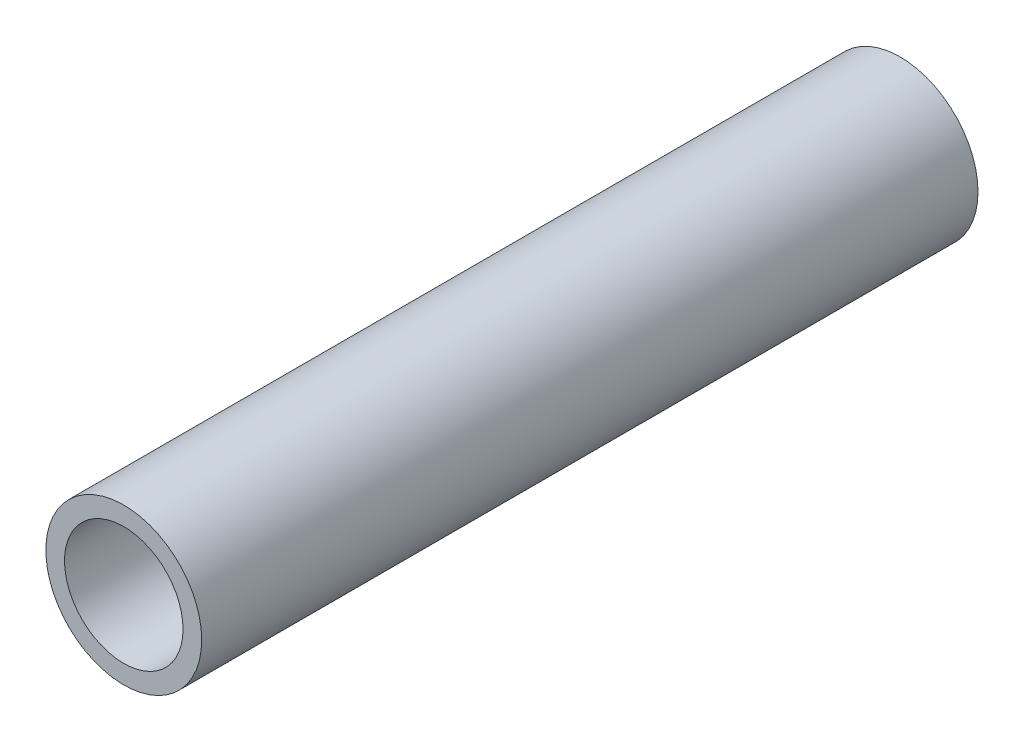
ISO-10303-21;
HEADER;
FILE_DESCRIPTION(('STEP AP214'),'2;1');
FILE_NAME('part.step','',(''),(''),'','','');
FILE_SCHEMA(('AUTOMOTIVE_DESIGN { 1 0 10303 214 1 1 1 1 }'));
ENDSEC;
DATA;
#1=APPLICATION_CONTEXT('core data for automotive mechanical design processes');
#2=APPLICATION_PROTOCOL_DEFINITION('international standard','automotive_design',2000,#1);
#3=PRODUCT_CONTEXT('',#1,'mechanical');
#4=PRODUCT('Part','Part','',(#3));
#5=PRODUCT_RELATED_PRODUCT_CATEGORY('part','',(#4));
#6=PRODUCT_DEFINITION_FORMATION('','',#4);
#7=PRODUCT_DEFINITION_CONTEXT('part definition',#1,'design');
#8=PRODUCT_DEFINITION('design','',#6,#7);
#9=PRODUCT_DEFINITION_SHAPE('','',#8);
#10=(LENGTH_UNIT() NAMED_UNIT(*) SI_UNIT(.MILLI.,.METRE.));
#11=(NAMED_UNIT(*) PLANE_ANGLE_UNIT() SI_UNIT($,.RADIAN.));
#12=(NAMED_UNIT(*) SI_UNIT($,.STERADIAN.) SOLID_ANGLE_UNIT());
#13=UNCERTAINTY_MEASURE_WITH_UNIT(LENGTH_MEASURE(1.E-05),#10,'distance_accuracy_value','');
#14=(GEOMETRIC_REPRESENTATION_CONTEXT(3) GLOBAL_UNCERTAINTY_ASSIGNED_CONTEXT((#13)) GLOBAL_UNIT_ASSIGNED_CONTEXT((#10,
#11,#12)) REPRESENTATION_CONTEXT('',''));
#15=CARTESIAN_POINT('',(0.,0.,0.));
#16=DIRECTION('',(0.,0.,1.));
#17=DIRECTION('',(1.,0.,0.));
#18=AXIS2_PLACEMENT_3D('',#15,#16,#17);
#19=CARTESIAN_POINT('',(0.,0.,166.37));
#20=DIRECTION('',(0.,0.,1.));
#21=DIRECTION('',(1.,0.,0.));
#22=AXIS2_PLACEMENT_3D('',#19,#20,#21);
#23=PLANE('',#22);
#24=CARTESIAN_POINT('',(0.,0.,166.37));
#25=DIRECTION('',(0.,0.,1.));
#26=DIRECTION('',(1.,0.,0.));
#27=AXIS2_PLACEMENT_3D('',#24,#25,#26);
#28=CIRCLE('',#27,16.7005);
#29=CARTESIAN_POINT('',(16.7005,0.,166.37));
#30=VERTEX_POINT('',#29);
#31=EDGE_CURVE('E10',#30,#30,#28,.T.);
#32=ORIENTED_EDGE('',*,*,#31,.T.);
#33=EDGE_LOOP('',(#32));
#34=FACE_BOUND('',#33,.T.);
#35=CARTESIAN_POINT('',(0.,0.,166.37));
#36=DIRECTION('',(0.,0.,1.));
#37=DIRECTION('',(1.,0.,0.));
#38=AXIS2_PLACEMENT_3D('',#35,#36,#37);
#39=CIRCLE('',#38,12.7);
#40=CARTESIAN_POINT('',(12.7,0.,166.37));
#41=VERTEX_POINT('',#40);
#42=EDGE_CURVE('E44',#41,#41,#39,.T.);
#43=ORIENTED_EDGE('',*,*,#42,.F.);
#44=EDGE_LOOP('',(#43));
#45=FACE_BOUND('',#44,.T.);
#46=ADVANCED_FACE('F33',(#34,#45),#23,.T.);
#47=CARTESIAN_POINT('',(0.,0.,0.));
#48=DIRECTION('',(0.,0.,1.));
#49=DIRECTION('',(1.,0.,0.));
#50=AXIS2_PLACEMENT_3D('',#47,#48,#49);
#51=PLANE('',#50);
#52=CARTESIAN_POINT('',(0.,0.,0.));
#53=DIRECTION('',(0.,0.,1.));
#54=DIRECTION('',(1.,0.,0.));
#55=AXIS2_PLACEMENT_3D('',#52,#53,#54);
#56=CIRCLE('',#55,16.7005);
#57=CARTESIAN_POINT('',(16.7005,0.,0.));
#58=VERTEX_POINT('',#57);
#59=EDGE_CURVE('E37',#58,#58,#56,.T.);
#60=ORIENTED_EDGE('',*,*,#59,.F.);
#61=EDGE_LOOP('',(#60));
#62=FACE_BOUND('',#61,.T.);
#63=CARTESIAN_POINT('',(0.,0.,0.));
#64=DIRECTION('',(0.,0.,1.));
#65=DIRECTION('',(1.,0.,0.));
#66=AXIS2_PLACEMENT_3D('',#63,#64,#65);
#67=CIRCLE('',#66,12.7);
#68=CARTESIAN_POINT('',(12.7,0.,0.));
#69=VERTEX_POINT('',#68);
#70=EDGE_CURVE('E46',#69,#69,#67,.T.);
#71=ORIENTED_EDGE('',*,*,#70,.T.);
#72=EDGE_LOOP('',(#71));
#73=FACE_BOUND('',#72,.T.);
#74=ADVANCED_FACE('F56',(#62,#73),#51,.F.);
#75=CARTESIAN_POINT('',(0.,0.,166.37));
#76=DIRECTION('',(0.,0.,-1.));
#77=DIRECTION('',(-1.,0.,0.));
#78=AXIS2_PLACEMENT_3D('',#75,#76,#77);
#79=CYLINDRICAL_SURFACE('',#78,16.7005);
#80=ORIENTED_EDGE('',*,*,#31,.F.);
#81=EDGE_LOOP('',(#80));
#82=FACE_BOUND('',#81,.T.);
#83=ORIENTED_EDGE('',*,*,#59,.T.);
#84=EDGE_LOOP('',(#83));
#85=FACE_BOUND('',#84,.T.);
#86=ADVANCED_FACE('F35',(#82,#85),#79,.T.);
#87=CARTESIAN_POINT('',(0.,0.,166.37));
#88=DIRECTION('',(0.,0.,-1.));
#89=DIRECTION('',(-1.,0.,0.));
#90=AXIS2_PLACEMENT_3D('',#87,#88,#89);
#91=CYLINDRICAL_SURFACE('',#90,12.7);
#92=ORIENTED_EDGE('',*,*,#42,.T.);
#93=EDGE_LOOP('',(#92));
#94=FACE_BOUND('',#93,.T.);
#95=ORIENTED_EDGE('',*,*,#70,.F.);
#96=EDGE_LOOP('',(#95));
#97=FACE_BOUND('',#96,.T.);
#98=ADVANCED_FACE('F52',(#94,#97),#91,.F.);
#99=CLOSED_SHELL('',(#46,#74,#86,#98));
#100=MANIFOLD_SOLID_BREP('B2',#99);
#101=ADVANCED_BREP_SHAPE_REPRESENTATION('',(#18,#100),#14);
#102=SHAPE_DEFINITION_REPRESENTATION(#9,#101);
ENDSEC;
END-ISO-10303-21;
